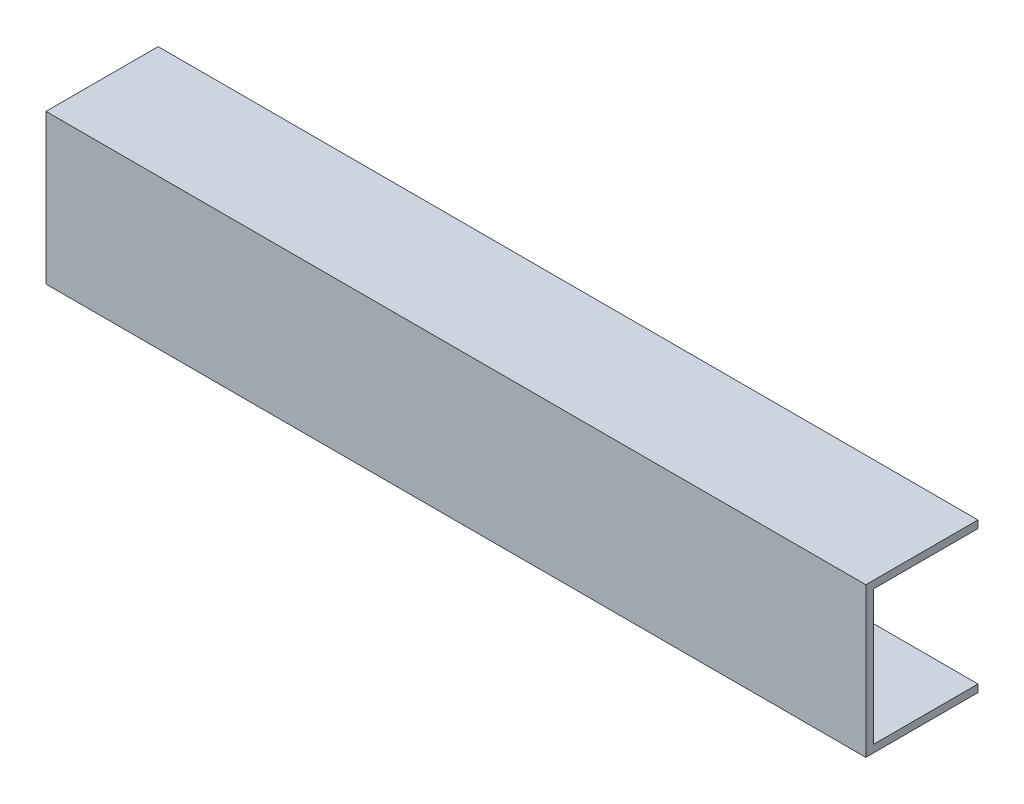
ISO-10303-21;
HEADER;
FILE_DESCRIPTION(('STEP AP214'),'2;1');
FILE_NAME('part.step','',(''),(''),'','','');
FILE_SCHEMA(('AUTOMOTIVE_DESIGN { 1 0 10303 214 1 1 1 1 }'));
ENDSEC;
DATA;
#1=APPLICATION_CONTEXT('core data for automotive mechanical design processes');
#2=APPLICATION_PROTOCOL_DEFINITION('international standard','automotive_design',2000,#1);
#3=PRODUCT_CONTEXT('',#1,'mechanical');
#4=PRODUCT('Part','Part','',(#3));
#5=PRODUCT_RELATED_PRODUCT_CATEGORY('part','',(#4));
#6=PRODUCT_DEFINITION_FORMATION('','',#4);
#7=PRODUCT_DEFINITION_CONTEXT('part definition',#1,'design');
#8=PRODUCT_DEFINITION('design','',#6,#7);
#9=PRODUCT_DEFINITION_SHAPE('','',#8);
#10=(LENGTH_UNIT() NAMED_UNIT(*) SI_UNIT(.MILLI.,.METRE.));
#11=(NAMED_UNIT(*) PLANE_ANGLE_UNIT() SI_UNIT($,.RADIAN.));
#12=(NAMED_UNIT(*) SI_UNIT($,.STERADIAN.) SOLID_ANGLE_UNIT());
#13=UNCERTAINTY_MEASURE_WITH_UNIT(LENGTH_MEASURE(1.E-05),#10,'distance_accuracy_value','');
#14=(GEOMETRIC_REPRESENTATION_CONTEXT(3) GLOBAL_UNCERTAINTY_ASSIGNED_CONTEXT((#13)) GLOBAL_UNIT_ASSIGNED_CONTEXT((#10,
#11,#12)) REPRESENTATION_CONTEXT('',''));
#15=CARTESIAN_POINT('',(0.,0.,0.));
#16=DIRECTION('',(0.,0.,1.));
#17=DIRECTION('',(1.,0.,0.));
#18=AXIS2_PLACEMENT_3D('',#15,#16,#17);
#19=CARTESIAN_POINT('',(0.,0.,10.));
#20=DIRECTION('',(0.,0.,1.));
#21=DIRECTION('',(1.,0.,0.));
#22=AXIS2_PLACEMENT_3D('',#19,#20,#21);
#23=PLANE('',#22);
#24=DIRECTION('',(0.,1.,0.));
#25=VECTOR('',#24,1.);
#26=CARTESIAN_POINT('',(70.,40.,10.));
#27=LINE('',#26,#25);
#28=CARTESIAN_POINT('',(70.,0.,10.));
#29=VERTEX_POINT('',#28);
#30=CARTESIAN_POINT('',(70.,2.,10.));
#31=VERTEX_POINT('',#30);
#32=EDGE_CURVE('E134',#29,#31,#27,.T.);
#33=ORIENTED_EDGE('',*,*,#32,.F.);
#34=DIRECTION('',(1.,0.,0.));
#35=VECTOR('',#34,1.);
#36=CARTESIAN_POINT('',(0.,0.,10.));
#37=LINE('',#36,#35);
#38=CARTESIAN_POINT('',(-149.25,0.,10.));
#39=VERTEX_POINT('',#38);
#40=EDGE_CURVE('E116',#39,#29,#37,.T.);
#41=ORIENTED_EDGE('',*,*,#40,.F.);
#42=DIRECTION('',(0.,-1.,0.));
#43=VECTOR('',#42,1.);
#44=CARTESIAN_POINT('',(-149.25,40.,10.));
#45=LINE('',#44,#43);
#46=CARTESIAN_POINT('',(-149.25,2.,10.));
#47=VERTEX_POINT('',#46);
#48=EDGE_CURVE('E168',#47,#39,#45,.T.);
#49=ORIENTED_EDGE('',*,*,#48,.F.);
#50=DIRECTION('',(-1.,0.,0.));
#51=VECTOR('',#50,1.);
#52=CARTESIAN_POINT('',(101.,2.,10.));
#53=LINE('',#52,#51);
#54=EDGE_CURVE('E155',#31,#47,#53,.T.);
#55=ORIENTED_EDGE('',*,*,#54,.F.);
#56=EDGE_LOOP('',(#33,#41,#49,#55));
#57=FACE_BOUND('',#56,.T.);
#58=ADVANCED_FACE('F34',(#57),#23,.F.);
#59=CARTESIAN_POINT('',(-149.25,40.,10.));
#60=VERTEX_POINT('',#59);
#61=CARTESIAN_POINT('',(-149.25,38.,10.));
#62=VERTEX_POINT('',#61);
#63=EDGE_CURVE('E37',#60,#62,#45,.T.);
#64=ORIENTED_EDGE('',*,*,#63,.F.);
#65=DIRECTION('',(1.,0.,0.));
#66=VECTOR('',#65,1.);
#67=CARTESIAN_POINT('',(0.,40.,10.));
#68=LINE('',#67,#66);
#69=CARTESIAN_POINT('',(70.,40.,10.));
#70=VERTEX_POINT('',#69);
#71=EDGE_CURVE('E42',#60,#70,#68,.T.);
#72=ORIENTED_EDGE('',*,*,#71,.T.);
#73=CARTESIAN_POINT('',(70.,38.,10.));
#74=VERTEX_POINT('',#73);
#75=EDGE_CURVE('E132',#74,#70,#27,.T.);
#76=ORIENTED_EDGE('',*,*,#75,.F.);
#77=DIRECTION('',(-1.,0.,0.));
#78=VECTOR('',#77,1.);
#79=CARTESIAN_POINT('',(101.,38.,10.));
#80=LINE('',#79,#78);
#81=EDGE_CURVE('E12',#74,#62,#80,.T.);
#82=ORIENTED_EDGE('',*,*,#81,.T.);
#83=EDGE_LOOP('',(#64,#72,#76,#82));
#84=FACE_BOUND('',#83,.T.);
#85=ADVANCED_FACE('F136',(#84),#23,.F.);
#86=CARTESIAN_POINT('',(-149.25,40.,-20.));
#87=DIRECTION('',(1.,0.,0.));
#88=DIRECTION('',(0.,0.,-1.));
#89=AXIS2_PLACEMENT_3D('',#86,#87,#88);
#90=PLANE('',#89);
#91=DIRECTION('',(0.,0.,1.));
#92=VECTOR('',#91,1.);
#93=CARTESIAN_POINT('',(-149.25,40.,-20.));
#94=LINE('',#93,#92);
#95=CARTESIAN_POINT('',(-149.25,40.,40.));
#96=VERTEX_POINT('',#95);
#97=EDGE_CURVE('E159',#60,#96,#94,.T.);
#98=ORIENTED_EDGE('',*,*,#97,.F.);
#99=ORIENTED_EDGE('',*,*,#63,.T.);
#100=DIRECTION('',(0.,0.,-1.));
#101=VECTOR('',#100,1.);
#102=CARTESIAN_POINT('',(-149.25,38.,10.));
#103=LINE('',#102,#101);
#104=CARTESIAN_POINT('',(-149.25,38.,38.));
#105=VERTEX_POINT('',#104);
#106=EDGE_CURVE('E154',#105,#62,#103,.T.);
#107=ORIENTED_EDGE('',*,*,#106,.F.);
#108=DIRECTION('',(0.,1.,0.));
#109=VECTOR('',#108,1.);
#110=CARTESIAN_POINT('',(-149.25,2.,38.));
#111=LINE('',#110,#109);
#112=CARTESIAN_POINT('',(-149.25,2.,38.));
#113=VERTEX_POINT('',#112);
#114=EDGE_CURVE('E151',#113,#105,#111,.T.);
#115=ORIENTED_EDGE('',*,*,#114,.F.);
#116=DIRECTION('',(0.,0.,1.));
#117=VECTOR('',#116,1.);
#118=CARTESIAN_POINT('',(-149.25,2.,10.));
#119=LINE('',#118,#117);
#120=EDGE_CURVE('E148',#47,#113,#119,.T.);
#121=ORIENTED_EDGE('',*,*,#120,.F.);
#122=ORIENTED_EDGE('',*,*,#48,.T.);
#123=DIRECTION('',(0.,0.,-1.));
#124=VECTOR('',#123,1.);
#125=CARTESIAN_POINT('',(-149.25,0.,-20.));
#126=LINE('',#125,#124);
#127=CARTESIAN_POINT('',(-149.25,0.,40.));
#128=VERTEX_POINT('',#127);
#129=EDGE_CURVE('E124',#128,#39,#126,.T.);
#130=ORIENTED_EDGE('',*,*,#129,.F.);
#131=DIRECTION('',(0.,-1.,0.));
#132=VECTOR('',#131,1.);
#133=CARTESIAN_POINT('',(-149.25,40.,40.));
#134=LINE('',#133,#132);
#135=EDGE_CURVE('E122',#96,#128,#134,.T.);
#136=ORIENTED_EDGE('',*,*,#135,.F.);
#137=EDGE_LOOP('',(#98,#99,#107,#115,#121,#122,#130,#136));
#138=FACE_BOUND('',#137,.T.);
#139=ADVANCED_FACE('F165',(#138),#90,.F.);
#140=CARTESIAN_POINT('',(-101.,40.,40.));
#141=DIRECTION('',(0.,0.,-1.));
#142=DIRECTION('',(-1.,0.,0.));
#143=AXIS2_PLACEMENT_3D('',#140,#141,#142);
#144=PLANE('',#143);
#145=DIRECTION('',(1.,0.,0.));
#146=VECTOR('',#145,1.);
#147=CARTESIAN_POINT('',(-101.,0.,40.));
#148=LINE('',#147,#146);
#149=CARTESIAN_POINT('',(70.,0.,40.));
#150=VERTEX_POINT('',#149);
#151=EDGE_CURVE('E113',#128,#150,#148,.T.);
#152=ORIENTED_EDGE('',*,*,#151,.T.);
#153=DIRECTION('',(0.,1.,0.));
#154=VECTOR('',#153,1.);
#155=CARTESIAN_POINT('',(70.,40.,40.));
#156=LINE('',#155,#154);
#157=CARTESIAN_POINT('',(70.,40.,40.));
#158=VERTEX_POINT('',#157);
#159=EDGE_CURVE('E98',#150,#158,#156,.T.);
#160=ORIENTED_EDGE('',*,*,#159,.T.);
#161=DIRECTION('',(1.,0.,0.));
#162=VECTOR('',#161,1.);
#163=CARTESIAN_POINT('',(-101.,40.,40.));
#164=LINE('',#163,#162);
#165=EDGE_CURVE('E123',#96,#158,#164,.T.);
#166=ORIENTED_EDGE('',*,*,#165,.F.);
#167=ORIENTED_EDGE('',*,*,#135,.T.);
#168=EDGE_LOOP('',(#152,#160,#166,#167));
#169=FACE_BOUND('',#168,.T.);
#170=ADVANCED_FACE('F120',(#169),#144,.F.);
#171=CARTESIAN_POINT('',(0.,40.,0.));
#172=DIRECTION('',(0.,1.,0.));
#173=DIRECTION('',(0.,0.,1.));
#174=AXIS2_PLACEMENT_3D('',#171,#172,#173);
#175=PLANE('',#174);
#176=ORIENTED_EDGE('',*,*,#71,.F.);
#177=ORIENTED_EDGE('',*,*,#97,.T.);
#178=ORIENTED_EDGE('',*,*,#165,.T.);
#179=DIRECTION('',(0.,0.,-1.));
#180=VECTOR('',#179,1.);
#181=CARTESIAN_POINT('',(70.,40.,40.));
#182=LINE('',#181,#180);
#183=EDGE_CURVE('E104',#158,#70,#182,.T.);
#184=ORIENTED_EDGE('',*,*,#183,.T.);
#185=EDGE_LOOP('',(#176,#177,#178,#184));
#186=FACE_BOUND('',#185,.T.);
#187=ADVANCED_FACE('F140',(#186),#175,.T.);
#188=CARTESIAN_POINT('',(101.,38.,10.));
#189=DIRECTION('',(0.,1.,0.));
#190=DIRECTION('',(0.,0.,1.));
#191=AXIS2_PLACEMENT_3D('',#188,#189,#190);
#192=PLANE('',#191);
#193=ORIENTED_EDGE('',*,*,#81,.F.);
#194=DIRECTION('',(0.,0.,1.));
#195=VECTOR('',#194,1.);
#196=CARTESIAN_POINT('',(70.,38.,10.));
#197=LINE('',#196,#195);
#198=CARTESIAN_POINT('',(70.,38.,38.));
#199=VERTEX_POINT('',#198);
#200=EDGE_CURVE('E144',#74,#199,#197,.T.);
#201=ORIENTED_EDGE('',*,*,#200,.T.);
#202=DIRECTION('',(-1.,0.,0.));
#203=VECTOR('',#202,1.);
#204=CARTESIAN_POINT('',(101.,38.,38.));
#205=LINE('',#204,#203);
#206=EDGE_CURVE('E157',#199,#105,#205,.T.);
#207=ORIENTED_EDGE('',*,*,#206,.T.);
#208=ORIENTED_EDGE('',*,*,#106,.T.);
#209=EDGE_LOOP('',(#193,#201,#207,#208));
#210=FACE_BOUND('',#209,.T.);
#211=ADVANCED_FACE('F178',(#210),#192,.F.);
#212=CARTESIAN_POINT('',(101.,2.,38.));
#213=DIRECTION('',(0.,0.,1.));
#214=DIRECTION('',(1.,0.,0.));
#215=AXIS2_PLACEMENT_3D('',#212,#213,#214);
#216=PLANE('',#215);
#217=ORIENTED_EDGE('',*,*,#206,.F.);
#218=DIRECTION('',(0.,-1.,0.));
#219=VECTOR('',#218,1.);
#220=CARTESIAN_POINT('',(70.,2.,38.));
#221=LINE('',#220,#219);
#222=CARTESIAN_POINT('',(70.,2.,38.));
#223=VERTEX_POINT('',#222);
#224=EDGE_CURVE('E141',#199,#223,#221,.T.);
#225=ORIENTED_EDGE('',*,*,#224,.T.);
#226=DIRECTION('',(-1.,0.,0.));
#227=VECTOR('',#226,1.);
#228=CARTESIAN_POINT('',(101.,2.,38.));
#229=LINE('',#228,#227);
#230=EDGE_CURVE('E160',#223,#113,#229,.T.);
#231=ORIENTED_EDGE('',*,*,#230,.T.);
#232=ORIENTED_EDGE('',*,*,#114,.T.);
#233=EDGE_LOOP('',(#217,#225,#231,#232));
#234=FACE_BOUND('',#233,.T.);
#235=ADVANCED_FACE('F176',(#234),#216,.F.);
#236=CARTESIAN_POINT('',(101.,2.,10.));
#237=DIRECTION('',(0.,-1.,0.));
#238=DIRECTION('',(0.,0.,-1.));
#239=AXIS2_PLACEMENT_3D('',#236,#237,#238);
#240=PLANE('',#239);
#241=ORIENTED_EDGE('',*,*,#230,.F.);
#242=DIRECTION('',(0.,0.,-1.));
#243=VECTOR('',#242,1.);
#244=CARTESIAN_POINT('',(70.,2.,10.));
#245=LINE('',#244,#243);
#246=EDGE_CURVE('E126',#223,#31,#245,.T.);
#247=ORIENTED_EDGE('',*,*,#246,.T.);
#248=ORIENTED_EDGE('',*,*,#54,.T.);
#249=ORIENTED_EDGE('',*,*,#120,.T.);
#250=EDGE_LOOP('',(#241,#247,#248,#249));
#251=FACE_BOUND('',#250,.T.);
#252=ADVANCED_FACE('F173',(#251),#240,.F.);
#253=CARTESIAN_POINT('',(0.,0.,0.));
#254=DIRECTION('',(0.,1.,0.));
#255=DIRECTION('',(0.,0.,1.));
#256=AXIS2_PLACEMENT_3D('',#253,#254,#255);
#257=PLANE('',#256);
#258=ORIENTED_EDGE('',*,*,#129,.T.);
#259=ORIENTED_EDGE('',*,*,#40,.T.);
#260=DIRECTION('',(0.,0.,-1.));
#261=VECTOR('',#260,1.);
#262=CARTESIAN_POINT('',(70.,0.,40.));
#263=LINE('',#262,#261);
#264=EDGE_CURVE('E102',#150,#29,#263,.T.);
#265=ORIENTED_EDGE('',*,*,#264,.F.);
#266=ORIENTED_EDGE('',*,*,#151,.F.);
#267=EDGE_LOOP('',(#258,#259,#265,#266));
#268=FACE_BOUND('',#267,.T.);
#269=ADVANCED_FACE('F112',(#268),#257,.F.);
#270=CARTESIAN_POINT('',(70.,40.,40.));
#271=DIRECTION('',(-1.,0.,0.));
#272=DIRECTION('',(0.,0.,1.));
#273=AXIS2_PLACEMENT_3D('',#270,#271,#272);
#274=PLANE('',#273);
#275=ORIENTED_EDGE('',*,*,#264,.T.);
#276=ORIENTED_EDGE('',*,*,#32,.T.);
#277=ORIENTED_EDGE('',*,*,#246,.F.);
#278=ORIENTED_EDGE('',*,*,#224,.F.);
#279=ORIENTED_EDGE('',*,*,#200,.F.);
#280=ORIENTED_EDGE('',*,*,#75,.T.);
#281=ORIENTED_EDGE('',*,*,#183,.F.);
#282=ORIENTED_EDGE('',*,*,#159,.F.);
#283=EDGE_LOOP('',(#275,#276,#277,#278,#279,#280,#281,#282));
#284=FACE_BOUND('',#283,.T.);
#285=ADVANCED_FACE('F100',(#284),#274,.F.);
#286=CLOSED_SHELL('',(#58,#85,#139,#170,#187,#211,#235,#252,#269,#285));
#287=MANIFOLD_SOLID_BREP('B2',#286);
#288=ADVANCED_BREP_SHAPE_REPRESENTATION('',(#18,#287),#14);
#289=SHAPE_DEFINITION_REPRESENTATION(#9,#288);
ENDSEC;
END-ISO-10303-21;
